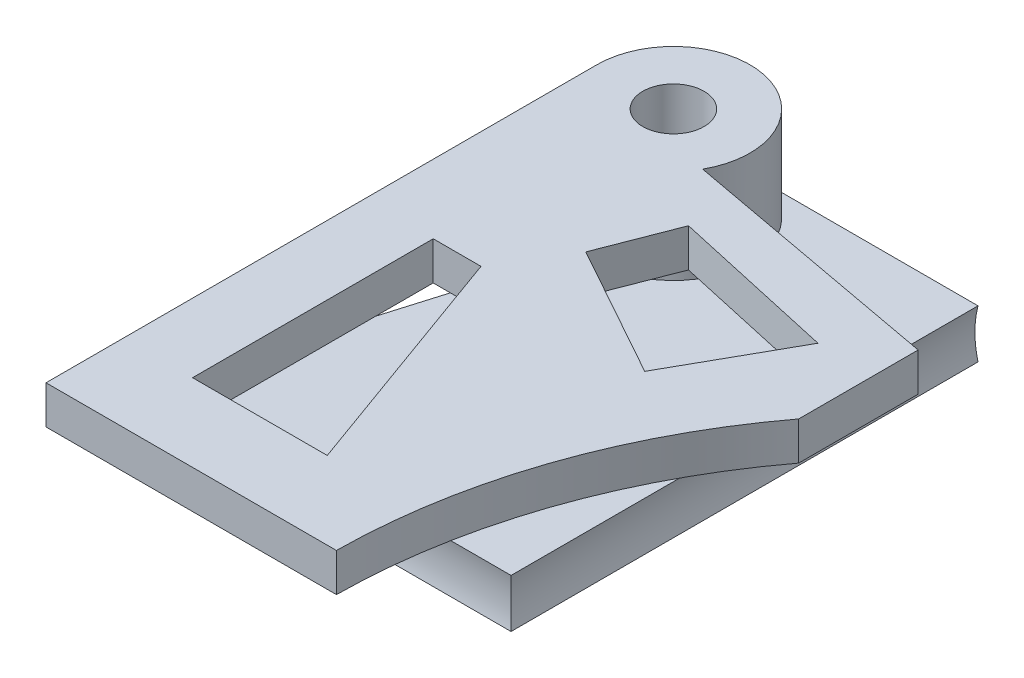
ISO-10303-21;
HEADER;
FILE_DESCRIPTION(('STEP AP214'),'2;1');
FILE_NAME('part.step','',(''),(''),'','','');
FILE_SCHEMA(('AUTOMOTIVE_DESIGN { 1 0 10303 214 1 1 1 1 }'));
ENDSEC;
DATA;
#1=APPLICATION_CONTEXT('core data for automotive mechanical design processes');
#2=APPLICATION_PROTOCOL_DEFINITION('international standard','automotive_design',2000,#1);
#3=PRODUCT_CONTEXT('',#1,'mechanical');
#4=PRODUCT('Part','Part','',(#3));
#5=PRODUCT_RELATED_PRODUCT_CATEGORY('part','',(#4));
#6=PRODUCT_DEFINITION_FORMATION('','',#4);
#7=PRODUCT_DEFINITION_CONTEXT('part definition',#1,'design');
#8=PRODUCT_DEFINITION('design','',#6,#7);
#9=PRODUCT_DEFINITION_SHAPE('','',#8);
#10=(LENGTH_UNIT() NAMED_UNIT(*) SI_UNIT(.MILLI.,.METRE.));
#11=(NAMED_UNIT(*) PLANE_ANGLE_UNIT() SI_UNIT($,.RADIAN.));
#12=(NAMED_UNIT(*) SI_UNIT($,.STERADIAN.) SOLID_ANGLE_UNIT());
#13=UNCERTAINTY_MEASURE_WITH_UNIT(LENGTH_MEASURE(1.E-05),#10,'distance_accuracy_value','');
#14=(GEOMETRIC_REPRESENTATION_CONTEXT(3) GLOBAL_UNCERTAINTY_ASSIGNED_CONTEXT((#13)) GLOBAL_UNIT_ASSIGNED_CONTEXT((#10,
#11,#12)) REPRESENTATION_CONTEXT('',''));
#15=CARTESIAN_POINT('',(0.,0.,0.));
#16=DIRECTION('',(0.,0.,1.));
#17=DIRECTION('',(1.,0.,0.));
#18=AXIS2_PLACEMENT_3D('',#15,#16,#17);
#19=CARTESIAN_POINT('',(1.00000033232463,18.7,-30.3800376147473));
#20=DIRECTION('',(0.,-1.,0.));
#21=DIRECTION('',(0.,0.,-1.));
#22=AXIS2_PLACEMENT_3D('',#19,#20,#21);
#23=CYLINDRICAL_SURFACE('',#22,10.);
#24=DIRECTION('',(0.,-1.,0.));
#25=VECTOR('',#24,1.);
#26=CARTESIAN_POINT('',(-1.17138886776207,6.35,-20.6186304958045));
#27=LINE('',#26,#25);
#28=CARTESIAN_POINT('',(-1.17138886776208,6.35,-20.6186304958045));
#29=VERTEX_POINT('',#28);
#30=CARTESIAN_POINT('',(-1.17138886776208,0.,-20.6186304958045));
#31=VERTEX_POINT('',#30);
#32=EDGE_CURVE('E43',#29,#31,#27,.T.);
#33=ORIENTED_EDGE('',*,*,#32,.F.);
#34=CARTESIAN_POINT('',(1.00000033232463,6.35,-30.3800376147473));
#35=DIRECTION('',(0.,1.,0.));
#36=DIRECTION('',(0.,0.,1.));
#37=AXIS2_PLACEMENT_3D('',#34,#35,#36);
#38=CIRCLE('',#37,10.);
#39=CARTESIAN_POINT('',(1.7979015477471,6.35,-40.3481544705244));
#40=VERTEX_POINT('',#39);
#41=EDGE_CURVE('E301',#29,#40,#38,.T.);
#42=ORIENTED_EDGE('',*,*,#41,.T.);
#43=DIRECTION('',(0.,-1.,0.));
#44=VECTOR('',#43,1.);
#45=CARTESIAN_POINT('',(1.7979015477471,6.35,-40.3481544705244));
#46=LINE('',#45,#44);
#47=CARTESIAN_POINT('',(1.7979015477471,0.,-40.3481544705244));
#48=VERTEX_POINT('',#47);
#49=EDGE_CURVE('E315',#40,#48,#46,.T.);
#50=ORIENTED_EDGE('',*,*,#49,.T.);
#51=CARTESIAN_POINT('',(1.00000033232463,0.,-30.3800376147473));
#52=DIRECTION('',(0.,1.,0.));
#53=DIRECTION('',(0.,0.,1.));
#54=AXIS2_PLACEMENT_3D('',#51,#52,#53);
#55=CIRCLE('',#54,10.);
#56=EDGE_CURVE('E58',#48,#31,#55,.T.);
#57=ORIENTED_EDGE('',*,*,#56,.T.);
#58=EDGE_LOOP('',(#33,#42,#50,#57));
#59=FACE_BOUND('',#58,.T.);
#60=DIRECTION('',(0.,1.,0.));
#61=VECTOR('',#60,1.);
#62=CARTESIAN_POINT('',(-8.99999966767537,13.7,-30.3800376147473));
#63=LINE('',#62,#61);
#64=CARTESIAN_POINT('',(-8.99999966767537,13.7,-30.3800376147473));
#65=VERTEX_POINT('',#64);
#66=CARTESIAN_POINT('',(-8.99999966767537,18.7,-30.3800376147473));
#67=VERTEX_POINT('',#66);
#68=EDGE_CURVE('E280',#65,#67,#63,.T.);
#69=ORIENTED_EDGE('',*,*,#68,.T.);
#70=CARTESIAN_POINT('',(1.00000033232463,18.7,-30.3800376147473));
#71=DIRECTION('',(0.,1.,0.));
#72=DIRECTION('',(0.,0.,1.));
#73=AXIS2_PLACEMENT_3D('',#70,#71,#72);
#74=CIRCLE('',#73,10.);
#75=CARTESIAN_POINT('',(9.71662070266324,18.7,-25.4789633121684));
#76=VERTEX_POINT('',#75);
#77=EDGE_CURVE('E295',#76,#67,#74,.T.);
#78=ORIENTED_EDGE('',*,*,#77,.F.);
#79=DIRECTION('',(0.,1.,0.));
#80=VECTOR('',#79,1.);
#81=CARTESIAN_POINT('',(9.71662070266324,13.7,-25.4789633121684));
#82=LINE('',#81,#80);
#83=CARTESIAN_POINT('',(9.71662070266324,13.7,-25.4789633121684));
#84=VERTEX_POINT('',#83);
#85=EDGE_CURVE('E283',#84,#76,#82,.T.);
#86=ORIENTED_EDGE('',*,*,#85,.F.);
#87=CARTESIAN_POINT('',(1.00000033232463,13.7,-30.3800376147473));
#88=DIRECTION('',(0.,1.,0.));
#89=DIRECTION('',(0.,0.,1.));
#90=AXIS2_PLACEMENT_3D('',#87,#88,#89);
#91=CIRCLE('',#90,10.);
#92=EDGE_CURVE('E200',#65,#84,#91,.T.);
#93=ORIENTED_EDGE('',*,*,#92,.F.);
#94=EDGE_LOOP('',(#69,#78,#86,#93));
#95=FACE_BOUND('',#94,.T.);
#96=ADVANCED_FACE('F35',(#59,#95),#23,.T.);
#97=CARTESIAN_POINT('',(-6.70339075246437,6.35,-1.99073300066198));
#98=DIRECTION('',(-0.958620960681187,0.,-0.284685534832168));
#99=DIRECTION('',(-0.284685534832168,0.,0.958620960681187));
#100=AXIS2_PLACEMENT_3D('',#97,#98,#99);
#101=PLANE('',#100);
#102=DIRECTION('',(0.284685534832168,0.,-0.958620960681187));
#103=VECTOR('',#102,1.);
#104=CARTESIAN_POINT('',(-6.70339075246437,0.,-1.99073300066198));
#105=LINE('',#104,#103);
#106=CARTESIAN_POINT('',(-13.4276486637989,0.,20.6518455294756));
#107=VERTEX_POINT('',#106);
#108=EDGE_CURVE('E297',#107,#31,#105,.T.);
#109=ORIENTED_EDGE('',*,*,#108,.F.);
#110=CARTESIAN_POINT('',(-17.0180804075159,3.175,32.7418982588892));
#111=DIRECTION('',(-0.958620960681187,0.,-0.284685534832168));
#112=DIRECTION('',(-0.284685534832168,0.,0.958620960681187));
#113=AXIS2_PLACEMENT_3D('',#110,#111,#112);
#114=ELLIPSE('',#113,13.0395646587131,12.5);
#115=CARTESIAN_POINT('',(-13.4276486637989,6.35,20.6518455294756));
#116=VERTEX_POINT('',#115);
#117=EDGE_CURVE('E262',#107,#116,#114,.F.);
#118=ORIENTED_EDGE('',*,*,#117,.T.);
#119=DIRECTION('',(0.284685534832168,0.,-0.958620960681187));
#120=VECTOR('',#119,1.);
#121=CARTESIAN_POINT('',(-6.70339075246437,6.35,-1.99073300066198));
#122=LINE('',#121,#120);
#123=EDGE_CURVE('E303',#116,#29,#122,.T.);
#124=ORIENTED_EDGE('',*,*,#123,.T.);
#125=ORIENTED_EDGE('',*,*,#32,.T.);
#126=EDGE_LOOP('',(#109,#118,#124,#125));
#127=FACE_BOUND('',#126,.T.);
#128=ADVANCED_FACE('F37',(#127),#101,.T.);
#129=CARTESIAN_POINT('',(42.9101876137485,3.175,-40.3800376147473));
#130=DIRECTION('',(0.,0.,1.));
#131=DIRECTION('',(1.,0.,0.));
#132=AXIS2_PLACEMENT_3D('',#129,#130,#131);
#133=CYLINDRICAL_SURFACE('',#132,12.5);
#134=CARTESIAN_POINT('',(42.9101876137485,3.175,32.7418982588892));
#135=DIRECTION('',(-0.707106781186547,0.,0.707106781186547));
#136=DIRECTION('',(0.707106781186547,0.,0.707106781186547));
#137=AXIS2_PLACEMENT_3D('',#134,#135,#136);
#138=ELLIPSE('',#137,17.6776695296637,12.5);
#139=CARTESIAN_POINT('',(30.8201348843349,0.,20.6518455294756));
#140=VERTEX_POINT('',#139);
#141=CARTESIAN_POINT('',(30.8201348843349,6.35000000000002,20.6518455294756));
#142=VERTEX_POINT('',#141);
#143=EDGE_CURVE('E11',#140,#142,#138,.F.);
#144=ORIENTED_EDGE('',*,*,#143,.F.);
#145=DIRECTION('',(0.,0.,1.));
#146=VECTOR('',#145,1.);
#147=CARTESIAN_POINT('',(30.8201348843349,0.,0.));
#148=LINE('',#147,#146);
#149=CARTESIAN_POINT('',(30.8201348843349,0.,-40.3481544705244));
#150=VERTEX_POINT('',#149);
#151=EDGE_CURVE('E320',#150,#140,#148,.T.);
#152=ORIENTED_EDGE('',*,*,#151,.F.);
#153=CARTESIAN_POINT('',(42.9101876137485,3.175,-40.3481544705244));
#154=DIRECTION('',(0.,0.,1.));
#155=DIRECTION('',(1.,0.,0.));
#156=AXIS2_PLACEMENT_3D('',#153,#154,#155);
#157=CIRCLE('',#156,12.5);
#158=CARTESIAN_POINT('',(30.8201348843349,6.35,-40.3481544705244));
#159=VERTEX_POINT('',#158);
#160=EDGE_CURVE('E288',#159,#150,#157,.T.);
#161=ORIENTED_EDGE('',*,*,#160,.F.);
#162=DIRECTION('',(0.,0.,1.));
#163=VECTOR('',#162,1.);
#164=CARTESIAN_POINT('',(30.8201348843349,6.35,0.));
#165=LINE('',#164,#163);
#166=EDGE_CURVE('E309',#159,#142,#165,.T.);
#167=ORIENTED_EDGE('',*,*,#166,.T.);
#168=EDGE_LOOP('',(#144,#152,#161,#167));
#169=FACE_BOUND('',#168,.T.);
#170=ADVANCED_FACE('F337',(#169),#133,.F.);
#171=CARTESIAN_POINT('',(0.,6.35,-40.3481544705244));
#172=DIRECTION('',(0.,0.,1.));
#173=DIRECTION('',(1.,0.,0.));
#174=AXIS2_PLACEMENT_3D('',#171,#172,#173);
#175=PLANE('',#174);
#176=DIRECTION('',(-1.,0.,0.));
#177=VECTOR('',#176,1.);
#178=CARTESIAN_POINT('',(0.,6.35,-40.3481544705244));
#179=LINE('',#178,#177);
#180=EDGE_CURVE('E312',#159,#40,#179,.T.);
#181=ORIENTED_EDGE('',*,*,#180,.F.);
#182=ORIENTED_EDGE('',*,*,#160,.T.);
#183=DIRECTION('',(-1.,0.,0.));
#184=VECTOR('',#183,1.);
#185=CARTESIAN_POINT('',(0.,0.,-40.3481544705244));
#186=LINE('',#185,#184);
#187=EDGE_CURVE('E304',#150,#48,#186,.T.);
#188=ORIENTED_EDGE('',*,*,#187,.T.);
#189=ORIENTED_EDGE('',*,*,#49,.F.);
#190=EDGE_LOOP('',(#181,#182,#188,#189));
#191=FACE_BOUND('',#190,.T.);
#192=ADVANCED_FACE('F346',(#191),#175,.F.);
#193=CARTESIAN_POINT('',(0.,6.35,0.));
#194=DIRECTION('',(0.,1.,0.));
#195=DIRECTION('',(0.,0.,1.));
#196=AXIS2_PLACEMENT_3D('',#193,#194,#195);
#197=PLANE('',#196);
#198=ORIENTED_EDGE('',*,*,#41,.F.);
#199=ORIENTED_EDGE('',*,*,#123,.F.);
#200=DIRECTION('',(-1.,0.,0.));
#201=VECTOR('',#200,1.);
#202=CARTESIAN_POINT('',(0.,6.35,20.6518455294756));
#203=LINE('',#202,#201);
#204=EDGE_CURVE('E307',#142,#116,#203,.T.);
#205=ORIENTED_EDGE('',*,*,#204,.F.);
#206=ORIENTED_EDGE('',*,*,#166,.F.);
#207=ORIENTED_EDGE('',*,*,#180,.T.);
#208=EDGE_LOOP('',(#198,#199,#205,#206,#207));
#209=FACE_BOUND('',#208,.T.);
#210=ADVANCED_FACE('F342',(#209),#197,.T.);
#211=CARTESIAN_POINT('',(0.,0.,0.));
#212=DIRECTION('',(0.,1.,0.));
#213=DIRECTION('',(0.,0.,1.));
#214=AXIS2_PLACEMENT_3D('',#211,#212,#213);
#215=PLANE('',#214);
#216=ORIENTED_EDGE('',*,*,#108,.T.);
#217=ORIENTED_EDGE('',*,*,#56,.F.);
#218=ORIENTED_EDGE('',*,*,#187,.F.);
#219=ORIENTED_EDGE('',*,*,#151,.T.);
#220=DIRECTION('',(-1.,0.,0.));
#221=VECTOR('',#220,1.);
#222=CARTESIAN_POINT('',(0.,0.,20.6518455294756));
#223=LINE('',#222,#221);
#224=EDGE_CURVE('E317',#140,#107,#223,.T.);
#225=ORIENTED_EDGE('',*,*,#224,.T.);
#226=EDGE_LOOP('',(#216,#217,#218,#219,#225));
#227=FACE_BOUND('',#226,.T.);
#228=CARTESIAN_POINT('',(1.00000033232463,0.,-30.3800376147473));
#229=DIRECTION('',(0.,1.,0.));
#230=DIRECTION('',(0.,0.,1.));
#231=AXIS2_PLACEMENT_3D('',#228,#229,#230);
#232=CIRCLE('',#231,4.00000000000003);
#233=CARTESIAN_POINT('',(1.00000033232463,0.,-26.3800376147472));
#234=VERTEX_POINT('',#233);
#235=EDGE_CURVE('E291',#234,#234,#232,.T.);
#236=ORIENTED_EDGE('',*,*,#235,.T.);
#237=EDGE_LOOP('',(#236));
#238=FACE_BOUND('',#237,.T.);
#239=ADVANCED_FACE('F331',(#227,#238),#215,.F.);
#240=CARTESIAN_POINT('',(1.00000033232463,18.7,-30.3800376147473));
#241=DIRECTION('',(0.,-1.,0.));
#242=DIRECTION('',(0.,0.,-1.));
#243=AXIS2_PLACEMENT_3D('',#240,#241,#242);
#244=CYLINDRICAL_SURFACE('',#243,4.00000000000003);
#245=CARTESIAN_POINT('',(1.00000033232463,18.7,-30.3800376147473));
#246=DIRECTION('',(0.,1.,0.));
#247=DIRECTION('',(0.,0.,1.));
#248=AXIS2_PLACEMENT_3D('',#245,#246,#247);
#249=CIRCLE('',#248,4.00000000000003);
#250=CARTESIAN_POINT('',(1.00000033232463,18.7,-26.3800376147472));
#251=VERTEX_POINT('',#250);
#252=EDGE_CURVE('E292',#251,#251,#249,.T.);
#253=ORIENTED_EDGE('',*,*,#252,.T.);
#254=EDGE_LOOP('',(#253));
#255=FACE_BOUND('',#254,.T.);
#256=ORIENTED_EDGE('',*,*,#235,.F.);
#257=EDGE_LOOP('',(#256));
#258=FACE_BOUND('',#257,.T.);
#259=ADVANCED_FACE('F363',(#255,#258),#244,.F.);
#260=CARTESIAN_POINT('',(0.,18.7,0.));
#261=DIRECTION('',(0.,1.,0.));
#262=DIRECTION('',(0.,0.,1.));
#263=AXIS2_PLACEMENT_3D('',#260,#261,#262);
#264=PLANE('',#263);
#265=ORIENTED_EDGE('',*,*,#252,.F.);
#266=EDGE_LOOP('',(#265));
#267=FACE_BOUND('',#266,.T.);
#268=ORIENTED_EDGE('',*,*,#77,.T.);
#269=DIRECTION('',(0.,0.,1.));
#270=VECTOR('',#269,1.);
#271=CARTESIAN_POINT('',(-8.99999966767537,18.7,0.));
#272=LINE('',#271,#270);
#273=CARTESIAN_POINT('',(-8.99999966767537,18.7,41.5829265259659));
#274=VERTEX_POINT('',#273);
#275=EDGE_CURVE('E234',#67,#274,#272,.T.);
#276=ORIENTED_EDGE('',*,*,#275,.T.);
#277=DIRECTION('',(1.,0.,0.));
#278=VECTOR('',#277,1.);
#279=CARTESIAN_POINT('',(0.,18.7,41.5829265259659));
#280=LINE('',#279,#278);
#281=CARTESIAN_POINT('',(28.9389247536803,18.7,41.5829265259659));
#282=VERTEX_POINT('',#281);
#283=EDGE_CURVE('E237',#274,#282,#280,.T.);
#284=ORIENTED_EDGE('',*,*,#283,.T.);
#285=CARTESIAN_POINT('',(105.058605063544,18.7,42.3067262364121));
#286=DIRECTION('',(0.,1.,0.));
#287=DIRECTION('',(0.,0.,1.));
#288=AXIS2_PLACEMENT_3D('',#285,#286,#287);
#289=CIRCLE('',#288,76.1231214316434);
#290=CARTESIAN_POINT('',(44.2560833527966,18.7,-3.49483454606326));
#291=VERTEX_POINT('',#290);
#292=EDGE_CURVE('E230',#291,#282,#289,.T.);
#293=ORIENTED_EDGE('',*,*,#292,.F.);
#294=DIRECTION('',(0.,0.,1.));
#295=VECTOR('',#294,1.);
#296=CARTESIAN_POINT('',(44.2560833527966,18.7,0.));
#297=LINE('',#296,#295);
#298=CARTESIAN_POINT('',(44.2560833527966,18.7,-19.0947584016533));
#299=VERTEX_POINT('',#298);
#300=EDGE_CURVE('E183',#299,#291,#297,.T.);
#301=ORIENTED_EDGE('',*,*,#300,.F.);
#302=DIRECTION('',(0.983343077419721,0.,0.181759159578583));
#303=VECTOR('',#302,1.);
#304=CARTESIAN_POINT('',(4.87489825911201,18.7,-26.3738975649847));
#305=LINE('',#304,#303);
#306=EDGE_CURVE('E50',#76,#299,#305,.T.);
#307=ORIENTED_EDGE('',*,*,#306,.F.);
#308=EDGE_LOOP('',(#268,#276,#284,#293,#301,#307));
#309=FACE_BOUND('',#308,.T.);
#310=DIRECTION('',(-0.489247059460938,0.,0.872145237221889));
#311=VECTOR('',#310,1.);
#312=CARTESIAN_POINT('',(22.4236152163665,18.7,12.5789688905906));
#313=LINE('',#312,#311);
#314=CARTESIAN_POINT('',(36.9490071859239,18.7,-13.3143935324531));
#315=VERTEX_POINT('',#314);
#316=CARTESIAN_POINT('',(28.8160092840299,18.7,1.18371176487417));
#317=VERTEX_POINT('',#316);
#318=EDGE_CURVE('E240',#315,#317,#313,.T.);
#319=ORIENTED_EDGE('',*,*,#318,.T.);
#320=DIRECTION('',(-0.873719350419663,0.,-0.486430361616379));
#321=VECTOR('',#320,1.);
#322=CARTESIAN_POINT('',(6.3152037491018,18.7,-11.3432798460565));
#323=LINE('',#322,#321);
#324=CARTESIAN_POINT('',(11.4551478709607,18.7,-8.48169176667736));
#325=VERTEX_POINT('',#324);
#326=EDGE_CURVE('E243',#317,#325,#323,.T.);
#327=ORIENTED_EDGE('',*,*,#326,.T.);
#328=DIRECTION('',(0.361434923231902,0.,-0.932397338192441));
#329=VECTOR('',#328,1.);
#330=CARTESIAN_POINT('',(7.10036402428828,18.7,2.75238830154995));
#331=LINE('',#330,#329);
#332=CARTESIAN_POINT('',(15.2018492399329,18.7,-18.1470952982289));
#333=VERTEX_POINT('',#332);
#334=EDGE_CURVE('E246',#325,#333,#331,.T.);
#335=ORIENTED_EDGE('',*,*,#334,.T.);
#336=DIRECTION('',(0.976187060183953,0.,0.216930457818656));
#337=VECTOR('',#336,1.);
#338=CARTESIAN_POINT('',(4.55829543915119,18.7,-20.5123294761804));
#339=LINE('',#338,#337);
#340=EDGE_CURVE('E249',#333,#315,#339,.T.);
#341=ORIENTED_EDGE('',*,*,#340,.T.);
#342=EDGE_LOOP('',(#319,#327,#335,#341));
#343=FACE_BOUND('',#342,.T.);
#344=DIRECTION('',(1.,0.,0.));
#345=VECTOR('',#344,1.);
#346=CARTESIAN_POINT('',(0.,18.7,0.));
#347=LINE('',#346,#345);
#348=CARTESIAN_POINT('',(0.,18.7,0.));
#349=VERTEX_POINT('',#348);
#350=CARTESIAN_POINT('',(6.24234596630367,18.7,0.));
#351=VERTEX_POINT('',#350);
#352=EDGE_CURVE('E252',#349,#351,#347,.T.);
#353=ORIENTED_EDGE('',*,*,#352,.T.);
#354=DIRECTION('',(0.339661347892719,0.,0.940547802478801));
#355=VECTOR('',#354,1.);
#356=CARTESIAN_POINT('',(5.52216756555275,18.7,-1.99422812286819));
#357=LINE('',#356,#355);
#358=CARTESIAN_POINT('',(17.5949786341937,18.7,31.4362931619335));
#359=VERTEX_POINT('',#358);
#360=EDGE_CURVE('E255',#351,#359,#357,.T.);
#361=ORIENTED_EDGE('',*,*,#360,.T.);
#362=DIRECTION('',(-1.,0.,0.));
#363=VECTOR('',#362,1.);
#364=CARTESIAN_POINT('',(0.,18.7,31.4362931619335));
#365=LINE('',#364,#363);
#366=CARTESIAN_POINT('',(0.,18.7,31.4362931619335));
#367=VERTEX_POINT('',#366);
#368=EDGE_CURVE('E196',#359,#367,#365,.T.);
#369=ORIENTED_EDGE('',*,*,#368,.T.);
#370=DIRECTION('',(0.,0.,-1.));
#371=VECTOR('',#370,1.);
#372=CARTESIAN_POINT('',(0.,18.7,0.));
#373=LINE('',#372,#371);
#374=EDGE_CURVE('E193',#367,#349,#373,.T.);
#375=ORIENTED_EDGE('',*,*,#374,.T.);
#376=EDGE_LOOP('',(#353,#361,#369,#375));
#377=FACE_BOUND('',#376,.T.);
#378=ADVANCED_FACE('F362',(#267,#309,#343,#377),#264,.T.);
#379=CARTESIAN_POINT('',(30.8201348843349,3.175,32.7418982588892));
#380=DIRECTION('',(-1.,0.,0.));
#381=DIRECTION('',(0.,0.,1.));
#382=AXIS2_PLACEMENT_3D('',#379,#380,#381);
#383=CYLINDRICAL_SURFACE('',#382,12.5);
#384=ORIENTED_EDGE('',*,*,#224,.F.);
#385=ORIENTED_EDGE('',*,*,#143,.T.);
#386=ORIENTED_EDGE('',*,*,#204,.T.);
#387=ORIENTED_EDGE('',*,*,#117,.F.);
#388=EDGE_LOOP('',(#384,#385,#386,#387));
#389=FACE_BOUND('',#388,.T.);
#390=ADVANCED_FACE('F335',(#389),#383,.F.);
#391=CARTESIAN_POINT('',(0.,13.7,0.));
#392=DIRECTION('',(0.,0.,1.));
#393=DIRECTION('',(1.,0.,0.));
#394=AXIS2_PLACEMENT_3D('',#391,#392,#393);
#395=PLANE('',#394);
#396=ORIENTED_EDGE('',*,*,#352,.F.);
#397=DIRECTION('',(0.,1.,0.));
#398=VECTOR('',#397,1.);
#399=CARTESIAN_POINT('',(0.,13.7,0.));
#400=LINE('',#399,#398);
#401=CARTESIAN_POINT('',(0.,13.7,0.));
#402=VERTEX_POINT('',#401);
#403=EDGE_CURVE('E260',#402,#349,#400,.T.);
#404=ORIENTED_EDGE('',*,*,#403,.F.);
#405=DIRECTION('',(1.,0.,0.));
#406=VECTOR('',#405,1.);
#407=CARTESIAN_POINT('',(0.,13.7,0.));
#408=LINE('',#407,#406);
#409=CARTESIAN_POINT('',(6.24234596630367,13.7,0.));
#410=VERTEX_POINT('',#409);
#411=EDGE_CURVE('E219',#402,#410,#408,.T.);
#412=ORIENTED_EDGE('',*,*,#411,.T.);
#413=DIRECTION('',(0.,1.,0.));
#414=VECTOR('',#413,1.);
#415=CARTESIAN_POINT('',(6.24234596630367,13.7,0.));
#416=LINE('',#415,#414);
#417=EDGE_CURVE('E267',#410,#351,#416,.T.);
#418=ORIENTED_EDGE('',*,*,#417,.T.);
#419=EDGE_LOOP('',(#396,#404,#412,#418));
#420=FACE_BOUND('',#419,.T.);
#421=ADVANCED_FACE('F388',(#420),#395,.T.);
#422=CARTESIAN_POINT('',(0.,13.7,0.));
#423=DIRECTION('',(1.,0.,0.));
#424=DIRECTION('',(0.,0.,-1.));
#425=AXIS2_PLACEMENT_3D('',#422,#423,#424);
#426=PLANE('',#425);
#427=ORIENTED_EDGE('',*,*,#374,.F.);
#428=DIRECTION('',(0.,1.,0.));
#429=VECTOR('',#428,1.);
#430=CARTESIAN_POINT('',(0.,13.7,31.4362931619335));
#431=LINE('',#430,#429);
#432=CARTESIAN_POINT('',(0.,13.7,31.4362931619335));
#433=VERTEX_POINT('',#432);
#434=EDGE_CURVE('E263',#433,#367,#431,.T.);
#435=ORIENTED_EDGE('',*,*,#434,.F.);
#436=DIRECTION('',(0.,0.,-1.));
#437=VECTOR('',#436,1.);
#438=CARTESIAN_POINT('',(0.,13.7,0.));
#439=LINE('',#438,#437);
#440=EDGE_CURVE('E188',#433,#402,#439,.T.);
#441=ORIENTED_EDGE('',*,*,#440,.T.);
#442=ORIENTED_EDGE('',*,*,#403,.T.);
#443=EDGE_LOOP('',(#427,#435,#441,#442));
#444=FACE_BOUND('',#443,.T.);
#445=ADVANCED_FACE('F394',(#444),#426,.T.);
#446=CARTESIAN_POINT('',(0.,13.7,31.4362931619335));
#447=DIRECTION('',(0.,0.,-1.));
#448=DIRECTION('',(-1.,0.,0.));
#449=AXIS2_PLACEMENT_3D('',#446,#447,#448);
#450=PLANE('',#449);
#451=ORIENTED_EDGE('',*,*,#368,.F.);
#452=DIRECTION('',(0.,1.,0.));
#453=VECTOR('',#452,1.);
#454=CARTESIAN_POINT('',(17.5949786341937,13.7,31.4362931619335));
#455=LINE('',#454,#453);
#456=CARTESIAN_POINT('',(17.5949786341937,13.7,31.4362931619335));
#457=VERTEX_POINT('',#456);
#458=EDGE_CURVE('E265',#457,#359,#455,.T.);
#459=ORIENTED_EDGE('',*,*,#458,.F.);
#460=DIRECTION('',(-1.,0.,0.));
#461=VECTOR('',#460,1.);
#462=CARTESIAN_POINT('',(0.,13.7,31.4362931619335));
#463=LINE('',#462,#461);
#464=EDGE_CURVE('E225',#457,#433,#463,.T.);
#465=ORIENTED_EDGE('',*,*,#464,.T.);
#466=ORIENTED_EDGE('',*,*,#434,.T.);
#467=EDGE_LOOP('',(#451,#459,#465,#466));
#468=FACE_BOUND('',#467,.T.);
#469=ADVANCED_FACE('F402',(#468),#450,.T.);
#470=CARTESIAN_POINT('',(22.4236152163665,13.7,12.5789688905906));
#471=DIRECTION('',(-0.872145237221889,0.,-0.489247059460938));
#472=DIRECTION('',(-0.489247059460938,0.,0.872145237221889));
#473=AXIS2_PLACEMENT_3D('',#470,#471,#472);
#474=PLANE('',#473);
#475=ORIENTED_EDGE('',*,*,#318,.F.);
#476=DIRECTION('',(0.,1.,0.));
#477=VECTOR('',#476,1.);
#478=CARTESIAN_POINT('',(36.9490071859239,13.7,-13.3143935324531));
#479=LINE('',#478,#477);
#480=CARTESIAN_POINT('',(36.9490071859239,13.7,-13.3143935324531));
#481=VERTEX_POINT('',#480);
#482=EDGE_CURVE('E269',#481,#315,#479,.T.);
#483=ORIENTED_EDGE('',*,*,#482,.F.);
#484=DIRECTION('',(-0.489247059460938,0.,0.872145237221889));
#485=VECTOR('',#484,1.);
#486=CARTESIAN_POINT('',(22.4236152163665,13.7,12.5789688905906));
#487=LINE('',#486,#485);
#488=CARTESIAN_POINT('',(28.8160092840299,13.7,1.18371176487417));
#489=VERTEX_POINT('',#488);
#490=EDGE_CURVE('E207',#481,#489,#487,.T.);
#491=ORIENTED_EDGE('',*,*,#490,.T.);
#492=DIRECTION('',(0.,1.,0.));
#493=VECTOR('',#492,1.);
#494=CARTESIAN_POINT('',(28.8160092840299,13.7,1.18371176487417));
#495=LINE('',#494,#493);
#496=EDGE_CURVE('E275',#489,#317,#495,.T.);
#497=ORIENTED_EDGE('',*,*,#496,.T.);
#498=EDGE_LOOP('',(#475,#483,#491,#497));
#499=FACE_BOUND('',#498,.T.);
#500=ADVANCED_FACE('F410',(#499),#474,.T.);
#501=CARTESIAN_POINT('',(4.55829543915119,13.7,-20.5123294761804));
#502=DIRECTION('',(-0.216930457818656,0.,0.976187060183953));
#503=DIRECTION('',(0.976187060183953,0.,0.216930457818656));
#504=AXIS2_PLACEMENT_3D('',#501,#502,#503);
#505=PLANE('',#504);
#506=ORIENTED_EDGE('',*,*,#340,.F.);
#507=DIRECTION('',(0.,1.,0.));
#508=VECTOR('',#507,1.);
#509=CARTESIAN_POINT('',(15.2018492399329,13.7,-18.1470952982289));
#510=LINE('',#509,#508);
#511=CARTESIAN_POINT('',(15.2018492399329,13.7,-18.1470952982289));
#512=VERTEX_POINT('',#511);
#513=EDGE_CURVE('E271',#512,#333,#510,.T.);
#514=ORIENTED_EDGE('',*,*,#513,.F.);
#515=DIRECTION('',(0.976187060183953,0.,0.216930457818656));
#516=VECTOR('',#515,1.);
#517=CARTESIAN_POINT('',(4.55829543915119,13.7,-20.5123294761804));
#518=LINE('',#517,#516);
#519=EDGE_CURVE('E216',#512,#481,#518,.T.);
#520=ORIENTED_EDGE('',*,*,#519,.T.);
#521=ORIENTED_EDGE('',*,*,#482,.T.);
#522=EDGE_LOOP('',(#506,#514,#520,#521));
#523=FACE_BOUND('',#522,.T.);
#524=ADVANCED_FACE('F418',(#523),#505,.T.);
#525=CARTESIAN_POINT('',(7.10036402428828,13.7,2.75238830154995));
#526=DIRECTION('',(0.932397338192441,0.,0.361434923231902));
#527=DIRECTION('',(0.361434923231902,0.,-0.932397338192441));
#528=AXIS2_PLACEMENT_3D('',#525,#526,#527);
#529=PLANE('',#528);
#530=ORIENTED_EDGE('',*,*,#334,.F.);
#531=DIRECTION('',(0.,1.,0.));
#532=VECTOR('',#531,1.);
#533=CARTESIAN_POINT('',(11.4551478709607,13.7,-8.48169176667736));
#534=LINE('',#533,#532);
#535=CARTESIAN_POINT('',(11.4551478709607,13.7,-8.48169176667736));
#536=VERTEX_POINT('',#535);
#537=EDGE_CURVE('E273',#536,#325,#534,.T.);
#538=ORIENTED_EDGE('',*,*,#537,.F.);
#539=DIRECTION('',(0.361434923231902,0.,-0.932397338192441));
#540=VECTOR('',#539,1.);
#541=CARTESIAN_POINT('',(7.10036402428828,13.7,2.75238830154995));
#542=LINE('',#541,#540);
#543=EDGE_CURVE('E213',#536,#512,#542,.T.);
#544=ORIENTED_EDGE('',*,*,#543,.T.);
#545=ORIENTED_EDGE('',*,*,#513,.T.);
#546=EDGE_LOOP('',(#530,#538,#544,#545));
#547=FACE_BOUND('',#546,.T.);
#548=ADVANCED_FACE('F426',(#547),#529,.T.);
#549=CARTESIAN_POINT('',(105.058605063544,13.7,42.3067262364121));
#550=DIRECTION('',(0.,1.,0.));
#551=DIRECTION('',(0.,0.,1.));
#552=AXIS2_PLACEMENT_3D('',#549,#550,#551);
#553=CYLINDRICAL_SURFACE('',#552,76.1231214316434);
#554=ORIENTED_EDGE('',*,*,#292,.T.);
#555=DIRECTION('',(0.,1.,0.));
#556=VECTOR('',#555,1.);
#557=CARTESIAN_POINT('',(28.9389247536803,13.7,41.5829265259659));
#558=LINE('',#557,#556);
#559=CARTESIAN_POINT('',(28.9389247536803,13.7,41.5829265259659));
#560=VERTEX_POINT('',#559);
#561=EDGE_CURVE('E191',#560,#282,#558,.T.);
#562=ORIENTED_EDGE('',*,*,#561,.F.);
#563=CARTESIAN_POINT('',(105.058605063544,13.7,42.3067262364121));
#564=DIRECTION('',(0.,1.,0.));
#565=DIRECTION('',(0.,0.,1.));
#566=AXIS2_PLACEMENT_3D('',#563,#564,#565);
#567=CIRCLE('',#566,76.1231214316434);
#568=CARTESIAN_POINT('',(44.2560833527966,13.7,-3.49483454606326));
#569=VERTEX_POINT('',#568);
#570=EDGE_CURVE('E172',#569,#560,#567,.T.);
#571=ORIENTED_EDGE('',*,*,#570,.F.);
#572=DIRECTION('',(0.,1.,0.));
#573=VECTOR('',#572,1.);
#574=CARTESIAN_POINT('',(44.2560833527966,13.7,-3.49483454606326));
#575=LINE('',#574,#573);
#576=EDGE_CURVE('E181',#569,#291,#575,.T.);
#577=ORIENTED_EDGE('',*,*,#576,.T.);
#578=EDGE_LOOP('',(#554,#562,#571,#577));
#579=FACE_BOUND('',#578,.T.);
#580=ADVANCED_FACE('F190',(#579),#553,.F.);
#581=CARTESIAN_POINT('',(0.,13.7,41.5829265259659));
#582=DIRECTION('',(0.,0.,1.));
#583=DIRECTION('',(1.,0.,0.));
#584=AXIS2_PLACEMENT_3D('',#581,#582,#583);
#585=PLANE('',#584);
#586=ORIENTED_EDGE('',*,*,#283,.F.);
#587=DIRECTION('',(0.,1.,0.));
#588=VECTOR('',#587,1.);
#589=CARTESIAN_POINT('',(-8.99999966767537,13.7,41.5829265259659));
#590=LINE('',#589,#588);
#591=CARTESIAN_POINT('',(-8.99999966767537,13.7,41.5829265259659));
#592=VERTEX_POINT('',#591);
#593=EDGE_CURVE('E278',#592,#274,#590,.T.);
#594=ORIENTED_EDGE('',*,*,#593,.F.);
#595=DIRECTION('',(1.,0.,0.));
#596=VECTOR('',#595,1.);
#597=CARTESIAN_POINT('',(0.,13.7,41.5829265259659));
#598=LINE('',#597,#596);
#599=EDGE_CURVE('E205',#592,#560,#598,.T.);
#600=ORIENTED_EDGE('',*,*,#599,.T.);
#601=ORIENTED_EDGE('',*,*,#561,.T.);
#602=EDGE_LOOP('',(#586,#594,#600,#601));
#603=FACE_BOUND('',#602,.T.);
#604=ADVANCED_FACE('F441',(#603),#585,.T.);
#605=CARTESIAN_POINT('',(-8.99999966767537,13.7,0.));
#606=DIRECTION('',(-1.,0.,0.));
#607=DIRECTION('',(0.,0.,1.));
#608=AXIS2_PLACEMENT_3D('',#605,#606,#607);
#609=PLANE('',#608);
#610=ORIENTED_EDGE('',*,*,#275,.F.);
#611=ORIENTED_EDGE('',*,*,#68,.F.);
#612=DIRECTION('',(0.,0.,1.));
#613=VECTOR('',#612,1.);
#614=CARTESIAN_POINT('',(-8.99999966767537,13.7,0.));
#615=LINE('',#614,#613);
#616=EDGE_CURVE('E202',#65,#592,#615,.T.);
#617=ORIENTED_EDGE('',*,*,#616,.T.);
#618=ORIENTED_EDGE('',*,*,#593,.T.);
#619=EDGE_LOOP('',(#610,#611,#617,#618));
#620=FACE_BOUND('',#619,.T.);
#621=ADVANCED_FACE('F448',(#620),#609,.T.);
#622=CARTESIAN_POINT('',(4.87489825911201,13.7,-26.3738975649847));
#623=DIRECTION('',(-0.181759159578583,0.,0.983343077419721));
#624=DIRECTION('',(0.983343077419721,0.,0.181759159578583));
#625=AXIS2_PLACEMENT_3D('',#622,#623,#624);
#626=PLANE('',#625);
#627=ORIENTED_EDGE('',*,*,#306,.T.);
#628=DIRECTION('',(0.,1.,0.));
#629=VECTOR('',#628,1.);
#630=CARTESIAN_POINT('',(44.2560833527966,13.7,-19.0947584016533));
#631=LINE('',#630,#629);
#632=CARTESIAN_POINT('',(44.2560833527966,13.7,-19.0947584016533));
#633=VERTEX_POINT('',#632);
#634=EDGE_CURVE('E187',#633,#299,#631,.T.);
#635=ORIENTED_EDGE('',*,*,#634,.F.);
#636=DIRECTION('',(0.983343077419721,0.,0.181759159578583));
#637=VECTOR('',#636,1.);
#638=CARTESIAN_POINT('',(4.87489825911201,13.7,-26.3738975649847));
#639=LINE('',#638,#637);
#640=EDGE_CURVE('E175',#84,#633,#639,.T.);
#641=ORIENTED_EDGE('',*,*,#640,.F.);
#642=ORIENTED_EDGE('',*,*,#85,.T.);
#643=EDGE_LOOP('',(#627,#635,#641,#642));
#644=FACE_BOUND('',#643,.T.);
#645=ADVANCED_FACE('F456',(#644),#626,.F.);
#646=CARTESIAN_POINT('',(6.3152037491018,13.7,-11.3432798460565));
#647=DIRECTION('',(0.486430361616379,0.,-0.873719350419663));
#648=DIRECTION('',(-0.873719350419663,0.,-0.486430361616379));
#649=AXIS2_PLACEMENT_3D('',#646,#647,#648);
#650=PLANE('',#649);
#651=ORIENTED_EDGE('',*,*,#326,.F.);
#652=ORIENTED_EDGE('',*,*,#496,.F.);
#653=DIRECTION('',(-0.873719350419663,0.,-0.486430361616379));
#654=VECTOR('',#653,1.);
#655=CARTESIAN_POINT('',(6.3152037491018,13.7,-11.3432798460565));
#656=LINE('',#655,#654);
#657=EDGE_CURVE('E210',#489,#536,#656,.T.);
#658=ORIENTED_EDGE('',*,*,#657,.T.);
#659=ORIENTED_EDGE('',*,*,#537,.T.);
#660=EDGE_LOOP('',(#651,#652,#658,#659));
#661=FACE_BOUND('',#660,.T.);
#662=ADVANCED_FACE('F464',(#661),#650,.T.);
#663=CARTESIAN_POINT('',(44.2560833527966,13.7,0.));
#664=DIRECTION('',(-1.,0.,0.));
#665=DIRECTION('',(0.,0.,1.));
#666=AXIS2_PLACEMENT_3D('',#663,#664,#665);
#667=PLANE('',#666);
#668=ORIENTED_EDGE('',*,*,#300,.T.);
#669=ORIENTED_EDGE('',*,*,#576,.F.);
#670=DIRECTION('',(0.,0.,1.));
#671=VECTOR('',#670,1.);
#672=CARTESIAN_POINT('',(44.2560833527966,13.7,0.));
#673=LINE('',#672,#671);
#674=EDGE_CURVE('E166',#633,#569,#673,.T.);
#675=ORIENTED_EDGE('',*,*,#674,.F.);
#676=ORIENTED_EDGE('',*,*,#634,.T.);
#677=EDGE_LOOP('',(#668,#669,#675,#676));
#678=FACE_BOUND('',#677,.T.);
#679=ADVANCED_FACE('F182',(#678),#667,.F.);
#680=CARTESIAN_POINT('',(5.52216756555275,13.7,-1.99422812286819));
#681=DIRECTION('',(-0.940547802478801,0.,0.339661347892719));
#682=DIRECTION('',(0.339661347892719,0.,0.940547802478801));
#683=AXIS2_PLACEMENT_3D('',#680,#681,#682);
#684=PLANE('',#683);
#685=ORIENTED_EDGE('',*,*,#360,.F.);
#686=ORIENTED_EDGE('',*,*,#417,.F.);
#687=DIRECTION('',(0.339661347892719,0.,0.940547802478801));
#688=VECTOR('',#687,1.);
#689=CARTESIAN_POINT('',(5.52216756555275,13.7,-1.99422812286819));
#690=LINE('',#689,#688);
#691=EDGE_CURVE('E222',#410,#457,#690,.T.);
#692=ORIENTED_EDGE('',*,*,#691,.T.);
#693=ORIENTED_EDGE('',*,*,#458,.T.);
#694=EDGE_LOOP('',(#685,#686,#692,#693));
#695=FACE_BOUND('',#694,.T.);
#696=ADVANCED_FACE('F479',(#695),#684,.T.);
#697=CARTESIAN_POINT('',(0.,13.7,0.));
#698=DIRECTION('',(0.,1.,0.));
#699=DIRECTION('',(0.,0.,1.));
#700=AXIS2_PLACEMENT_3D('',#697,#698,#699);
#701=PLANE('',#700);
#702=ORIENTED_EDGE('',*,*,#570,.T.);
#703=ORIENTED_EDGE('',*,*,#599,.F.);
#704=ORIENTED_EDGE('',*,*,#616,.F.);
#705=ORIENTED_EDGE('',*,*,#92,.T.);
#706=ORIENTED_EDGE('',*,*,#640,.T.);
#707=ORIENTED_EDGE('',*,*,#674,.T.);
#708=EDGE_LOOP('',(#702,#703,#704,#705,#706,#707));
#709=FACE_BOUND('',#708,.T.);
#710=ORIENTED_EDGE('',*,*,#490,.F.);
#711=ORIENTED_EDGE('',*,*,#519,.F.);
#712=ORIENTED_EDGE('',*,*,#543,.F.);
#713=ORIENTED_EDGE('',*,*,#657,.F.);
#714=EDGE_LOOP('',(#710,#711,#712,#713));
#715=FACE_BOUND('',#714,.T.);
#716=ORIENTED_EDGE('',*,*,#411,.F.);
#717=ORIENTED_EDGE('',*,*,#440,.F.);
#718=ORIENTED_EDGE('',*,*,#464,.F.);
#719=ORIENTED_EDGE('',*,*,#691,.F.);
#720=EDGE_LOOP('',(#716,#717,#718,#719));
#721=FACE_BOUND('',#720,.T.);
#722=ADVANCED_FACE('F168',(#709,#715,#721),#701,.F.);
#723=CLOSED_SHELL('',(#96,#128,#170,#192,#210,#239,#259,#378,#390,#421,#445,#469,#500,#524,#548,
#580,#604,#621,#645,#662,#679,#696,#722));
#724=MANIFOLD_SOLID_BREP('B2',#723);
#725=ADVANCED_BREP_SHAPE_REPRESENTATION('',(#18,#724),#14);
#726=SHAPE_DEFINITION_REPRESENTATION(#9,#725);
ENDSEC;
END-ISO-10303-21;
